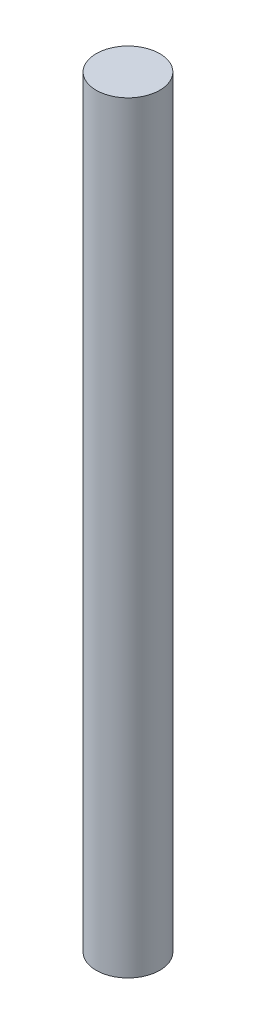
ISO-10303-21;
HEADER;
FILE_DESCRIPTION(('STEP AP214'),'2;1');
FILE_NAME('part.step','',(''),(''),'','','');
FILE_SCHEMA(('AUTOMOTIVE_DESIGN { 1 0 10303 214 1 1 1 1 }'));
ENDSEC;
DATA;
#1=APPLICATION_CONTEXT('core data for automotive mechanical design processes');
#2=APPLICATION_PROTOCOL_DEFINITION('international standard','automotive_design',2000,#1);
#3=PRODUCT_CONTEXT('',#1,'mechanical');
#4=PRODUCT('Part','Part','',(#3));
#5=PRODUCT_RELATED_PRODUCT_CATEGORY('part','',(#4));
#6=PRODUCT_DEFINITION_FORMATION('','',#4);
#7=PRODUCT_DEFINITION_CONTEXT('part definition',#1,'design');
#8=PRODUCT_DEFINITION('design','',#6,#7);
#9=PRODUCT_DEFINITION_SHAPE('','',#8);
#10=(LENGTH_UNIT() NAMED_UNIT(*) SI_UNIT(.MILLI.,.METRE.));
#11=(NAMED_UNIT(*) PLANE_ANGLE_UNIT() SI_UNIT($,.RADIAN.));
#12=(NAMED_UNIT(*) SI_UNIT($,.STERADIAN.) SOLID_ANGLE_UNIT());
#13=UNCERTAINTY_MEASURE_WITH_UNIT(LENGTH_MEASURE(1.E-05),#10,'distance_accuracy_value','');
#14=(GEOMETRIC_REPRESENTATION_CONTEXT(3) GLOBAL_UNCERTAINTY_ASSIGNED_CONTEXT((#13)) GLOBAL_UNIT_ASSIGNED_CONTEXT((#10,
#11,#12)) REPRESENTATION_CONTEXT('',''));
#15=CARTESIAN_POINT('',(0.,0.,0.));
#16=DIRECTION('',(0.,0.,1.));
#17=DIRECTION('',(1.,0.,0.));
#18=AXIS2_PLACEMENT_3D('',#15,#16,#17);
#19=CARTESIAN_POINT('',(0.,96.,0.));
#20=DIRECTION('',(0.,-1.,0.));
#21=DIRECTION('',(0.,0.,-1.));
#22=AXIS2_PLACEMENT_3D('',#19,#20,#21);
#23=CYLINDRICAL_SURFACE('',#22,4.);
#24=CARTESIAN_POINT('',(0.,96.,0.));
#25=DIRECTION('',(0.,1.,0.));
#26=DIRECTION('',(0.,0.,1.));
#27=AXIS2_PLACEMENT_3D('',#24,#25,#26);
#28=CIRCLE('',#27,4.);
#29=CARTESIAN_POINT('',(0.,96.,4.));
#30=VERTEX_POINT('',#29);
#31=EDGE_CURVE('E10',#30,#30,#28,.T.);
#32=ORIENTED_EDGE('',*,*,#31,.F.);
#33=EDGE_LOOP('',(#32));
#34=FACE_BOUND('',#33,.T.);
#35=CARTESIAN_POINT('',(0.,0.,0.));
#36=DIRECTION('',(0.,1.,0.));
#37=DIRECTION('',(0.,0.,1.));
#38=AXIS2_PLACEMENT_3D('',#35,#36,#37);
#39=CIRCLE('',#38,4.);
#40=CARTESIAN_POINT('',(0.,0.,4.));
#41=VERTEX_POINT('',#40);
#42=EDGE_CURVE('E34',#41,#41,#39,.T.);
#43=ORIENTED_EDGE('',*,*,#42,.T.);
#44=EDGE_LOOP('',(#43));
#45=FACE_BOUND('',#44,.T.);
#46=ADVANCED_FACE('F31',(#34,#45),#23,.T.);
#47=CARTESIAN_POINT('',(0.,96.,0.));
#48=DIRECTION('',(0.,1.,0.));
#49=DIRECTION('',(0.,0.,1.));
#50=AXIS2_PLACEMENT_3D('',#47,#48,#49);
#51=PLANE('',#50);
#52=ORIENTED_EDGE('',*,*,#31,.T.);
#53=EDGE_LOOP('',(#52));
#54=FACE_BOUND('',#53,.T.);
#55=ADVANCED_FACE('F46',(#54),#51,.T.);
#56=CARTESIAN_POINT('',(0.,0.,0.));
#57=DIRECTION('',(0.,1.,0.));
#58=DIRECTION('',(0.,0.,1.));
#59=AXIS2_PLACEMENT_3D('',#56,#57,#58);
#60=PLANE('',#59);
#61=ORIENTED_EDGE('',*,*,#42,.F.);
#62=EDGE_LOOP('',(#61));
#63=FACE_BOUND('',#62,.T.);
#64=ADVANCED_FACE('F44',(#63),#60,.F.);
#65=CLOSED_SHELL('',(#46,#55,#64));
#66=MANIFOLD_SOLID_BREP('B2',#65);
#67=ADVANCED_BREP_SHAPE_REPRESENTATION('',(#18,#66),#14);
#68=SHAPE_DEFINITION_REPRESENTATION(#9,#67);
ENDSEC;
END-ISO-10303-21;
